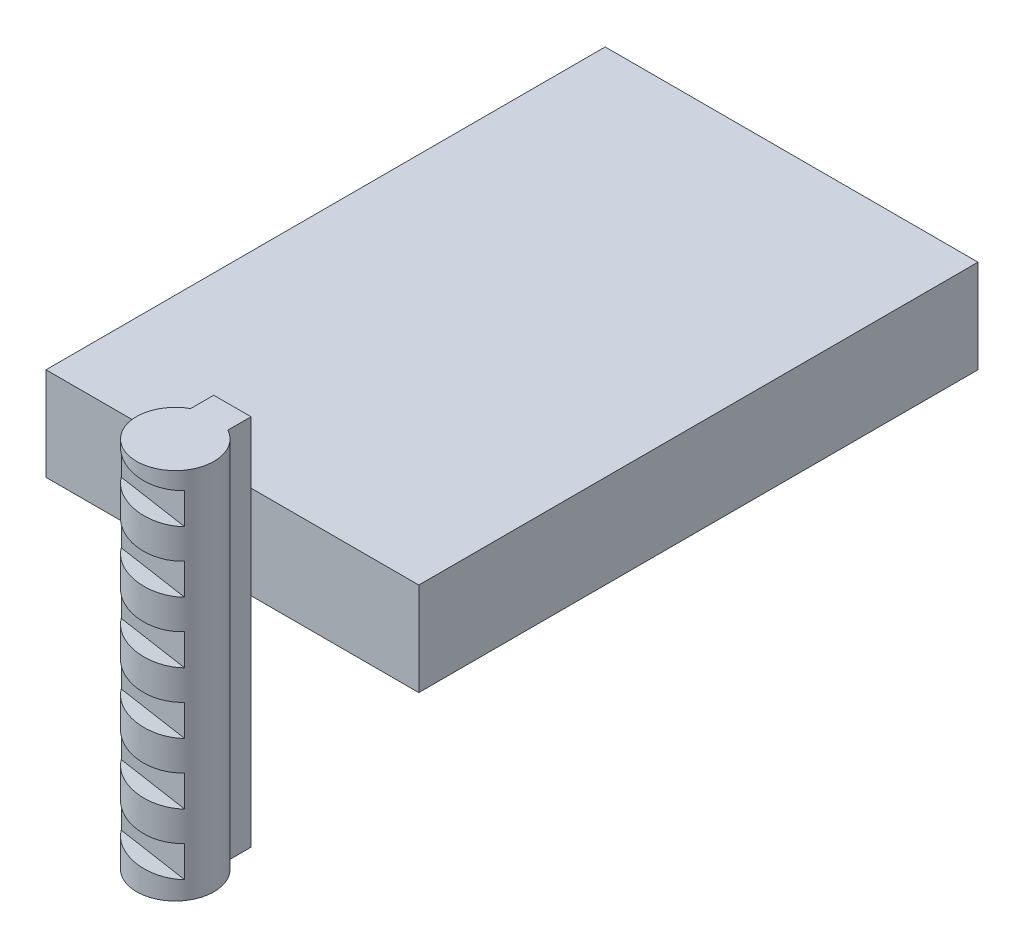
ISO-10303-21;
HEADER;
FILE_DESCRIPTION(('STEP AP214'),'2;1');
FILE_NAME('part.step','',(''),(''),'','','');
FILE_SCHEMA(('AUTOMOTIVE_DESIGN { 1 0 10303 214 1 1 1 1 }'));
ENDSEC;
DATA;
#1=APPLICATION_CONTEXT('core data for automotive mechanical design processes');
#2=APPLICATION_PROTOCOL_DEFINITION('international standard','automotive_design',2000,#1);
#3=PRODUCT_CONTEXT('',#1,'mechanical');
#4=PRODUCT('Part','Part','',(#3));
#5=PRODUCT_RELATED_PRODUCT_CATEGORY('part','',(#4));
#6=PRODUCT_DEFINITION_FORMATION('','',#4);
#7=PRODUCT_DEFINITION_CONTEXT('part definition',#1,'design');
#8=PRODUCT_DEFINITION('design','',#6,#7);
#9=PRODUCT_DEFINITION_SHAPE('','',#8);
#10=(LENGTH_UNIT() NAMED_UNIT(*) SI_UNIT(.MILLI.,.METRE.));
#11=(NAMED_UNIT(*) PLANE_ANGLE_UNIT() SI_UNIT($,.RADIAN.));
#12=(NAMED_UNIT(*) SI_UNIT($,.STERADIAN.) SOLID_ANGLE_UNIT());
#13=UNCERTAINTY_MEASURE_WITH_UNIT(LENGTH_MEASURE(1.E-05),#10,'distance_accuracy_value','');
#14=(GEOMETRIC_REPRESENTATION_CONTEXT(3) GLOBAL_UNCERTAINTY_ASSIGNED_CONTEXT((#13)) GLOBAL_UNIT_ASSIGNED_CONTEXT((#10,
#11,#12)) REPRESENTATION_CONTEXT('',''));
#15=CARTESIAN_POINT('',(0.,0.,0.));
#16=DIRECTION('',(0.,0.,1.));
#17=DIRECTION('',(1.,0.,0.));
#18=AXIS2_PLACEMENT_3D('',#15,#16,#17);
#19=CARTESIAN_POINT('',(-1.27,25.4,-3.89197217023223));
#20=DIRECTION('',(0.,0.,1.));
#21=DIRECTION('',(1.,0.,0.));
#22=AXIS2_PLACEMENT_3D('',#19,#20,#21);
#23=PLANE('',#22);
#24=DIRECTION('',(-1.,0.,0.));
#25=VECTOR('',#24,1.);
#26=CARTESIAN_POINT('',(12.7,14.8361124952174,-3.89197217023223));
#27=LINE('',#26,#25);
#28=CARTESIAN_POINT('',(1.27,14.8361124952174,-3.89197217023223));
#29=VERTEX_POINT('',#28);
#30=CARTESIAN_POINT('',(-1.27,14.8361124952174,-3.89197217023223));
#31=VERTEX_POINT('',#30);
#32=EDGE_CURVE('E364',#29,#31,#27,.T.);
#33=ORIENTED_EDGE('',*,*,#32,.F.);
#34=DIRECTION('',(0.,-1.,0.));
#35=VECTOR('',#34,1.);
#36=CARTESIAN_POINT('',(1.27,25.4,-3.89197217023223));
#37=LINE('',#36,#35);
#38=CARTESIAN_POINT('',(1.27,0.,-3.89197217023223));
#39=VERTEX_POINT('',#38);
#40=EDGE_CURVE('E413',#29,#39,#37,.T.);
#41=ORIENTED_EDGE('',*,*,#40,.T.);
#42=DIRECTION('',(-1.,0.,0.));
#43=VECTOR('',#42,1.);
#44=CARTESIAN_POINT('',(-1.27,0.,-3.89197217023223));
#45=LINE('',#44,#43);
#46=CARTESIAN_POINT('',(-1.27,0.,-3.89197217023223));
#47=VERTEX_POINT('',#46);
#48=EDGE_CURVE('E386',#39,#47,#45,.T.);
#49=ORIENTED_EDGE('',*,*,#48,.T.);
#50=DIRECTION('',(0.,-1.,0.));
#51=VECTOR('',#50,1.);
#52=CARTESIAN_POINT('',(-1.27,25.4,-3.89197217023223));
#53=LINE('',#52,#51);
#54=EDGE_CURVE('E395',#31,#47,#53,.T.);
#55=ORIENTED_EDGE('',*,*,#54,.F.);
#56=EDGE_LOOP('',(#33,#41,#49,#55));
#57=FACE_BOUND('',#56,.T.);
#58=ADVANCED_FACE('F41',(#57),#23,.F.);
#59=DIRECTION('',(1.,0.,0.));
#60=VECTOR('',#59,1.);
#61=CARTESIAN_POINT('',(12.7,21.1861124952174,-3.89197217023223));
#62=LINE('',#61,#60);
#63=CARTESIAN_POINT('',(-1.27,21.1861124952174,-3.89197217023223));
#64=VERTEX_POINT('',#63);
#65=CARTESIAN_POINT('',(1.27,21.1861124952174,-3.89197217023223));
#66=VERTEX_POINT('',#65);
#67=EDGE_CURVE('E357',#64,#66,#62,.T.);
#68=ORIENTED_EDGE('',*,*,#67,.F.);
#69=CARTESIAN_POINT('',(-1.27,25.4,-3.89197217023223));
#70=VERTEX_POINT('',#69);
#71=EDGE_CURVE('E409',#70,#64,#53,.T.);
#72=ORIENTED_EDGE('',*,*,#71,.F.);
#73=DIRECTION('',(-1.,0.,0.));
#74=VECTOR('',#73,1.);
#75=CARTESIAN_POINT('',(-1.27,25.4,-3.89197217023223));
#76=LINE('',#75,#74);
#77=CARTESIAN_POINT('',(1.27,25.4,-3.89197217023223));
#78=VERTEX_POINT('',#77);
#79=EDGE_CURVE('E392',#78,#70,#76,.T.);
#80=ORIENTED_EDGE('',*,*,#79,.F.);
#81=EDGE_CURVE('E415',#78,#66,#37,.T.);
#82=ORIENTED_EDGE('',*,*,#81,.T.);
#83=EDGE_LOOP('',(#68,#72,#80,#82));
#84=FACE_BOUND('',#83,.T.);
#85=ADVANCED_FACE('F483',(#84),#23,.F.);
#86=CARTESIAN_POINT('',(-1.27,25.4,-3.89197217023223));
#87=DIRECTION('',(1.,0.,0.));
#88=DIRECTION('',(0.,0.,-1.));
#89=AXIS2_PLACEMENT_3D('',#86,#87,#88);
#90=PLANE('',#89);
#91=DIRECTION('',(0.,0.,1.));
#92=VECTOR('',#91,1.);
#93=CARTESIAN_POINT('',(-1.27,0.,-3.89197217023223));
#94=LINE('',#93,#92);
#95=CARTESIAN_POINT('',(-1.27,0.,-2.31565629823223));
#96=VERTEX_POINT('',#95);
#97=EDGE_CURVE('E380',#47,#96,#94,.T.);
#98=ORIENTED_EDGE('',*,*,#97,.T.);
#99=DIRECTION('',(0.,-1.,0.));
#100=VECTOR('',#99,1.);
#101=CARTESIAN_POINT('',(-1.27,25.4,-2.31565629823223));
#102=LINE('',#101,#100);
#103=CARTESIAN_POINT('',(-1.27,25.4,-2.31565629823223));
#104=VERTEX_POINT('',#103);
#105=EDGE_CURVE('E423',#104,#96,#102,.T.);
#106=ORIENTED_EDGE('',*,*,#105,.F.);
#107=DIRECTION('',(0.,0.,1.));
#108=VECTOR('',#107,1.);
#109=CARTESIAN_POINT('',(-1.27,25.4,-3.89197217023223));
#110=LINE('',#109,#108);
#111=EDGE_CURVE('E381',#70,#104,#110,.T.);
#112=ORIENTED_EDGE('',*,*,#111,.F.);
#113=ORIENTED_EDGE('',*,*,#71,.T.);
#114=EDGE_CURVE('E414',#64,#31,#53,.T.);
#115=ORIENTED_EDGE('',*,*,#114,.T.);
#116=ORIENTED_EDGE('',*,*,#54,.T.);
#117=EDGE_LOOP('',(#98,#106,#112,#113,#115,#116));
#118=FACE_BOUND('',#117,.T.);
#119=ADVANCED_FACE('F43',(#118),#90,.F.);
#120=CARTESIAN_POINT('',(0.,25.4,0.));
#121=DIRECTION('',(0.,-1.,0.));
#122=DIRECTION('',(0.,0.,-1.));
#123=AXIS2_PLACEMENT_3D('',#120,#121,#122);
#124=CYLINDRICAL_SURFACE('',#123,2.64105359497731);
#125=CARTESIAN_POINT('',(0.,24.6324120030244,0.));
#126=DIRECTION('',(0.173542395888909,0.984207834737689,0.034899496702501));
#127=DIRECTION('',(0.964890402631267,-0.17701677333222,0.194040132109626));
#128=AXIS2_PLACEMENT_3D('',#125,#126,#127);
#129=ELLIPSE('',#128,2.68343077728213,2.64105359497731);
#130=CARTESIAN_POINT('',(-2.15698588116441,24.9587065654191,1.524));
#131=VERTEX_POINT('',#130);
#132=CARTESIAN_POINT('',(2.15698588116441,24.1980369497061,1.524));
#133=VERTEX_POINT('',#132);
#134=EDGE_CURVE('E50',#131,#133,#129,.T.);
#135=ORIENTED_EDGE('',*,*,#134,.T.);
#136=DIRECTION('',(0.,-1.,0.));
#137=VECTOR('',#136,1.);
#138=CARTESIAN_POINT('',(2.15698588116441,25.4,1.524));
#139=LINE('',#138,#137);
#140=CARTESIAN_POINT('',(2.15698588116441,22.0662491375512,1.524));
#141=VERTEX_POINT('',#140);
#142=EDGE_CURVE('E11',#133,#141,#139,.T.);
#143=ORIENTED_EDGE('',*,*,#142,.T.);
#144=CARTESIAN_POINT('',(0.,22.392543699946,0.));
#145=DIRECTION('',(-0.173542395888909,-0.984207834737689,0.034899496702501));
#146=DIRECTION('',(0.964890402631267,-0.17701677333222,-0.194040132109626));
#147=AXIS2_PLACEMENT_3D('',#144,#145,#146);
#148=ELLIPSE('',#147,2.68343077728213,2.64105359497731);
#149=CARTESIAN_POINT('',(-2.15698588116441,22.8269187532642,1.524));
#150=VERTEX_POINT('',#149);
#151=EDGE_CURVE('E287',#141,#150,#148,.T.);
#152=ORIENTED_EDGE('',*,*,#151,.T.);
#153=DIRECTION('',(0.,-1.,0.));
#154=VECTOR('',#153,1.);
#155=CARTESIAN_POINT('',(-2.15698588116441,25.4,1.524));
#156=LINE('',#155,#154);
#157=EDGE_CURVE('E283',#150,#131,#156,.F.);
#158=ORIENTED_EDGE('',*,*,#157,.T.);
#159=EDGE_LOOP('',(#135,#143,#152,#158));
#160=FACE_BOUND('',#159,.T.);
#161=CARTESIAN_POINT('',(0.,16.3012120030244,0.));
#162=DIRECTION('',(0.173542395888909,0.984207834737689,0.034899496702501));
#163=DIRECTION('',(0.964890402631267,-0.17701677333222,0.194040132109626));
#164=AXIS2_PLACEMENT_3D('',#161,#162,#163);
#165=ELLIPSE('',#164,2.68343077728213,2.64105359497731);
#166=CARTESIAN_POINT('',(-2.15698588116441,16.6275065654191,1.524));
#167=VERTEX_POINT('',#166);
#168=CARTESIAN_POINT('',(2.15698588116441,15.8668369497061,1.524));
#169=VERTEX_POINT('',#168);
#170=EDGE_CURVE('E275',#167,#169,#165,.T.);
#171=ORIENTED_EDGE('',*,*,#170,.T.);
#172=DIRECTION('',(0.,-1.,0.));
#173=VECTOR('',#172,1.);
#174=CARTESIAN_POINT('',(2.15698588116441,25.4,1.524));
#175=LINE('',#174,#173);
#176=CARTESIAN_POINT('',(2.15698588116441,13.7350491375512,1.524));
#177=VERTEX_POINT('',#176);
#178=EDGE_CURVE('E279',#169,#177,#175,.T.);
#179=ORIENTED_EDGE('',*,*,#178,.T.);
#180=CARTESIAN_POINT('',(0.,14.061343699946,0.));
#181=DIRECTION('',(-0.173542395888909,-0.984207834737689,0.034899496702501));
#182=DIRECTION('',(0.964890402631267,-0.17701677333222,-0.194040132109626));
#183=AXIS2_PLACEMENT_3D('',#180,#181,#182);
#184=ELLIPSE('',#183,2.68343077728213,2.64105359497731);
#185=CARTESIAN_POINT('',(-2.15698588116441,14.4957187532642,1.524));
#186=VERTEX_POINT('',#185);
#187=EDGE_CURVE('E271',#177,#186,#184,.T.);
#188=ORIENTED_EDGE('',*,*,#187,.T.);
#189=DIRECTION('',(0.,-1.,0.));
#190=VECTOR('',#189,1.);
#191=CARTESIAN_POINT('',(-2.15698588116441,25.4,1.524));
#192=LINE('',#191,#190);
#193=EDGE_CURVE('E267',#186,#167,#192,.F.);
#194=ORIENTED_EDGE('',*,*,#193,.T.);
#195=EDGE_LOOP('',(#171,#179,#188,#194));
#196=FACE_BOUND('',#195,.T.);
#197=CARTESIAN_POINT('',(0.,20.4668120030244,0.));
#198=DIRECTION('',(0.173542395888909,0.984207834737689,0.034899496702501));
#199=DIRECTION('',(0.964890402631267,-0.17701677333222,0.194040132109626));
#200=AXIS2_PLACEMENT_3D('',#197,#198,#199);
#201=ELLIPSE('',#200,2.68343077728213,2.64105359497731);
#202=CARTESIAN_POINT('',(-2.15698588116441,20.7931065654191,1.524));
#203=VERTEX_POINT('',#202);
#204=CARTESIAN_POINT('',(2.15698588116441,20.0324369497061,1.524));
#205=VERTEX_POINT('',#204);
#206=EDGE_CURVE('E259',#203,#205,#201,.T.);
#207=ORIENTED_EDGE('',*,*,#206,.T.);
#208=DIRECTION('',(0.,-1.,0.));
#209=VECTOR('',#208,1.);
#210=CARTESIAN_POINT('',(2.15698588116441,25.4,1.524));
#211=LINE('',#210,#209);
#212=CARTESIAN_POINT('',(2.15698588116441,17.9006491375512,1.524));
#213=VERTEX_POINT('',#212);
#214=EDGE_CURVE('E263',#205,#213,#211,.T.);
#215=ORIENTED_EDGE('',*,*,#214,.T.);
#216=CARTESIAN_POINT('',(0.,18.226943699946,0.));
#217=DIRECTION('',(-0.173542395888909,-0.984207834737689,0.034899496702501));
#218=DIRECTION('',(0.964890402631267,-0.17701677333222,-0.194040132109626));
#219=AXIS2_PLACEMENT_3D('',#216,#217,#218);
#220=ELLIPSE('',#219,2.68343077728213,2.64105359497731);
#221=CARTESIAN_POINT('',(-2.15698588116441,18.6613187532642,1.524));
#222=VERTEX_POINT('',#221);
#223=EDGE_CURVE('E255',#213,#222,#220,.T.);
#224=ORIENTED_EDGE('',*,*,#223,.T.);
#225=DIRECTION('',(0.,-1.,0.));
#226=VECTOR('',#225,1.);
#227=CARTESIAN_POINT('',(-2.15698588116441,25.4,1.524));
#228=LINE('',#227,#226);
#229=EDGE_CURVE('E251',#222,#203,#228,.F.);
#230=ORIENTED_EDGE('',*,*,#229,.T.);
#231=EDGE_LOOP('',(#207,#215,#224,#230));
#232=FACE_BOUND('',#231,.T.);
#233=CARTESIAN_POINT('',(0.,12.1356120030244,0.));
#234=DIRECTION('',(0.173542395888909,0.984207834737689,0.034899496702501));
#235=DIRECTION('',(0.964890402631267,-0.17701677333222,0.194040132109626));
#236=AXIS2_PLACEMENT_3D('',#233,#234,#235);
#237=ELLIPSE('',#236,2.68343077728213,2.64105359497731);
#238=CARTESIAN_POINT('',(-2.15698588116441,12.4619065654191,1.524));
#239=VERTEX_POINT('',#238);
#240=CARTESIAN_POINT('',(2.15698588116441,11.7012369497061,1.524));
#241=VERTEX_POINT('',#240);
#242=EDGE_CURVE('E243',#239,#241,#237,.T.);
#243=ORIENTED_EDGE('',*,*,#242,.T.);
#244=DIRECTION('',(0.,-1.,0.));
#245=VECTOR('',#244,1.);
#246=CARTESIAN_POINT('',(2.15698588116441,25.4,1.524));
#247=LINE('',#246,#245);
#248=CARTESIAN_POINT('',(2.15698588116441,9.56944913755123,1.524));
#249=VERTEX_POINT('',#248);
#250=EDGE_CURVE('E247',#241,#249,#247,.T.);
#251=ORIENTED_EDGE('',*,*,#250,.T.);
#252=CARTESIAN_POINT('',(0.,9.89574369994597,0.));
#253=DIRECTION('',(-0.173542395888909,-0.984207834737689,0.034899496702501));
#254=DIRECTION('',(0.964890402631267,-0.17701677333222,-0.194040132109626));
#255=AXIS2_PLACEMENT_3D('',#252,#253,#254);
#256=ELLIPSE('',#255,2.68343077728213,2.64105359497731);
#257=CARTESIAN_POINT('',(-2.15698588116441,10.3301187532642,1.524));
#258=VERTEX_POINT('',#257);
#259=EDGE_CURVE('E239',#249,#258,#256,.T.);
#260=ORIENTED_EDGE('',*,*,#259,.T.);
#261=DIRECTION('',(0.,-1.,0.));
#262=VECTOR('',#261,1.);
#263=CARTESIAN_POINT('',(-2.15698588116441,25.4,1.524));
#264=LINE('',#263,#262);
#265=EDGE_CURVE('E235',#258,#239,#264,.F.);
#266=ORIENTED_EDGE('',*,*,#265,.T.);
#267=EDGE_LOOP('',(#243,#251,#260,#266));
#268=FACE_BOUND('',#267,.T.);
#269=CARTESIAN_POINT('',(0.,7.97001200302437,0.));
#270=DIRECTION('',(0.173542395888909,0.984207834737689,0.034899496702501));
#271=DIRECTION('',(0.964890402631267,-0.17701677333222,0.194040132109626));
#272=AXIS2_PLACEMENT_3D('',#269,#270,#271);
#273=ELLIPSE('',#272,2.68343077728213,2.64105359497731);
#274=CARTESIAN_POINT('',(-2.15698588116441,8.29630656541911,1.524));
#275=VERTEX_POINT('',#274);
#276=CARTESIAN_POINT('',(2.15698588116441,7.53563694970611,1.524));
#277=VERTEX_POINT('',#276);
#278=EDGE_CURVE('E227',#275,#277,#273,.T.);
#279=ORIENTED_EDGE('',*,*,#278,.T.);
#280=DIRECTION('',(0.,-1.,0.));
#281=VECTOR('',#280,1.);
#282=CARTESIAN_POINT('',(2.15698588116441,25.4,1.524));
#283=LINE('',#282,#281);
#284=CARTESIAN_POINT('',(2.15698588116441,5.40384913755124,1.524));
#285=VERTEX_POINT('',#284);
#286=EDGE_CURVE('E231',#277,#285,#283,.T.);
#287=ORIENTED_EDGE('',*,*,#286,.T.);
#288=CARTESIAN_POINT('',(0.,5.73014369994597,0.));
#289=DIRECTION('',(-0.173542395888909,-0.984207834737689,0.034899496702501));
#290=DIRECTION('',(0.964890402631267,-0.17701677333222,-0.194040132109626));
#291=AXIS2_PLACEMENT_3D('',#288,#289,#290);
#292=ELLIPSE('',#291,2.68343077728213,2.64105359497731);
#293=CARTESIAN_POINT('',(-2.15698588116441,6.16451875326423,1.524));
#294=VERTEX_POINT('',#293);
#295=EDGE_CURVE('E223',#285,#294,#292,.T.);
#296=ORIENTED_EDGE('',*,*,#295,.T.);
#297=DIRECTION('',(0.,-1.,0.));
#298=VECTOR('',#297,1.);
#299=CARTESIAN_POINT('',(-2.15698588116441,25.4,1.524));
#300=LINE('',#299,#298);
#301=EDGE_CURVE('E202',#294,#275,#300,.F.);
#302=ORIENTED_EDGE('',*,*,#301,.T.);
#303=EDGE_LOOP('',(#279,#287,#296,#302));
#304=FACE_BOUND('',#303,.T.);
#305=CARTESIAN_POINT('',(0.,3.80441200302437,0.));
#306=DIRECTION('',(0.173542395888909,0.984207834737689,0.034899496702501));
#307=DIRECTION('',(0.964890402631267,-0.17701677333222,0.194040132109626));
#308=AXIS2_PLACEMENT_3D('',#305,#306,#307);
#309=ELLIPSE('',#308,2.68343077728213,2.64105359497731);
#310=CARTESIAN_POINT('',(-2.15698588116441,4.13070656541911,1.524));
#311=VERTEX_POINT('',#310);
#312=CARTESIAN_POINT('',(2.15698588116441,3.37003694970611,1.524));
#313=VERTEX_POINT('',#312);
#314=EDGE_CURVE('E203',#311,#313,#309,.T.);
#315=ORIENTED_EDGE('',*,*,#314,.T.);
#316=DIRECTION('',(0.,-1.,0.));
#317=VECTOR('',#316,1.);
#318=CARTESIAN_POINT('',(2.15698588116441,25.4,1.524));
#319=LINE('',#318,#317);
#320=CARTESIAN_POINT('',(2.15698588116441,1.23824913755124,1.524));
#321=VERTEX_POINT('',#320);
#322=EDGE_CURVE('E191',#313,#321,#319,.T.);
#323=ORIENTED_EDGE('',*,*,#322,.T.);
#324=CARTESIAN_POINT('',(0.,1.56454369994597,0.));
#325=DIRECTION('',(-0.173542395888909,-0.984207834737689,0.034899496702501));
#326=DIRECTION('',(0.964890402631267,-0.17701677333222,-0.194040132109626));
#327=AXIS2_PLACEMENT_3D('',#324,#325,#326);
#328=ELLIPSE('',#327,2.68343077728213,2.64105359497731);
#329=CARTESIAN_POINT('',(-2.15698588116441,1.99891875326423,1.524));
#330=VERTEX_POINT('',#329);
#331=EDGE_CURVE('E214',#321,#330,#328,.T.);
#332=ORIENTED_EDGE('',*,*,#331,.T.);
#333=DIRECTION('',(0.,-1.,0.));
#334=VECTOR('',#333,1.);
#335=CARTESIAN_POINT('',(-2.15698588116441,25.4,1.524));
#336=LINE('',#335,#334);
#337=EDGE_CURVE('E212',#330,#311,#336,.F.);
#338=ORIENTED_EDGE('',*,*,#337,.T.);
#339=EDGE_LOOP('',(#315,#323,#332,#338));
#340=FACE_BOUND('',#339,.T.);
#341=CARTESIAN_POINT('',(0.,0.,0.));
#342=DIRECTION('',(0.,1.,0.));
#343=DIRECTION('',(0.,0.,1.));
#344=AXIS2_PLACEMENT_3D('',#341,#342,#343);
#345=CIRCLE('',#344,2.64105359497731);
#346=CARTESIAN_POINT('',(1.27,0.,-2.31565629823223));
#347=VERTEX_POINT('',#346);
#348=EDGE_CURVE('E399',#96,#347,#345,.T.);
#349=ORIENTED_EDGE('',*,*,#348,.T.);
#350=DIRECTION('',(0.,-1.,0.));
#351=VECTOR('',#350,1.);
#352=CARTESIAN_POINT('',(1.27,25.4,-2.31565629823223));
#353=LINE('',#352,#351);
#354=CARTESIAN_POINT('',(1.27,25.4,-2.31565629823223));
#355=VERTEX_POINT('',#354);
#356=EDGE_CURVE('E418',#355,#347,#353,.T.);
#357=ORIENTED_EDGE('',*,*,#356,.F.);
#358=CARTESIAN_POINT('',(0.,25.4,0.));
#359=DIRECTION('',(0.,1.,0.));
#360=DIRECTION('',(0.,0.,1.));
#361=AXIS2_PLACEMENT_3D('',#358,#359,#360);
#362=CIRCLE('',#361,2.64105359497731);
#363=EDGE_CURVE('E385',#104,#355,#362,.T.);
#364=ORIENTED_EDGE('',*,*,#363,.F.);
#365=ORIENTED_EDGE('',*,*,#105,.T.);
#366=EDGE_LOOP('',(#349,#357,#364,#365));
#367=FACE_BOUND('',#366,.T.);
#368=ADVANCED_FACE('F210',(#160,#196,#232,#268,#304,#340,#367),#124,.T.);
#369=CARTESIAN_POINT('',(1.27,25.4,-3.89197217023223));
#370=DIRECTION('',(-1.,0.,0.));
#371=DIRECTION('',(0.,0.,1.));
#372=AXIS2_PLACEMENT_3D('',#369,#370,#371);
#373=PLANE('',#372);
#374=DIRECTION('',(0.,0.,-1.));
#375=VECTOR('',#374,1.);
#376=CARTESIAN_POINT('',(1.27,0.,-3.89197217023223));
#377=LINE('',#376,#375);
#378=EDGE_CURVE('E402',#347,#39,#377,.T.);
#379=ORIENTED_EDGE('',*,*,#378,.T.);
#380=ORIENTED_EDGE('',*,*,#40,.F.);
#381=EDGE_CURVE('E419',#66,#29,#37,.T.);
#382=ORIENTED_EDGE('',*,*,#381,.F.);
#383=ORIENTED_EDGE('',*,*,#81,.F.);
#384=DIRECTION('',(0.,0.,-1.));
#385=VECTOR('',#384,1.);
#386=CARTESIAN_POINT('',(1.27,25.4,-3.89197217023223));
#387=LINE('',#386,#385);
#388=EDGE_CURVE('E389',#355,#78,#387,.T.);
#389=ORIENTED_EDGE('',*,*,#388,.F.);
#390=ORIENTED_EDGE('',*,*,#356,.T.);
#391=EDGE_LOOP('',(#379,#380,#382,#383,#389,#390));
#392=FACE_BOUND('',#391,.T.);
#393=ADVANCED_FACE('F470',(#392),#373,.F.);
#394=CARTESIAN_POINT('',(0.,25.4,0.));
#395=DIRECTION('',(0.,1.,0.));
#396=DIRECTION('',(0.,0.,1.));
#397=AXIS2_PLACEMENT_3D('',#394,#395,#396);
#398=PLANE('',#397);
#399=ORIENTED_EDGE('',*,*,#111,.T.);
#400=ORIENTED_EDGE('',*,*,#363,.T.);
#401=ORIENTED_EDGE('',*,*,#388,.T.);
#402=ORIENTED_EDGE('',*,*,#79,.T.);
#403=EDGE_LOOP('',(#399,#400,#401,#402));
#404=FACE_BOUND('',#403,.T.);
#405=ADVANCED_FACE('F503',(#404),#398,.T.);
#406=CARTESIAN_POINT('',(0.,0.,0.));
#407=DIRECTION('',(0.,1.,0.));
#408=DIRECTION('',(0.,0.,1.));
#409=AXIS2_PLACEMENT_3D('',#406,#407,#408);
#410=PLANE('',#409);
#411=ORIENTED_EDGE('',*,*,#97,.F.);
#412=ORIENTED_EDGE('',*,*,#48,.F.);
#413=ORIENTED_EDGE('',*,*,#378,.F.);
#414=ORIENTED_EDGE('',*,*,#348,.F.);
#415=EDGE_LOOP('',(#411,#412,#413,#414));
#416=FACE_BOUND('',#415,.T.);
#417=ADVANCED_FACE('F474',(#416),#410,.F.);
#418=CARTESIAN_POINT('',(0.,0.,-3.89197217023223));
#419=DIRECTION('',(0.,0.,-1.));
#420=DIRECTION('',(-1.,0.,0.));
#421=AXIS2_PLACEMENT_3D('',#418,#419,#420);
#422=PLANE('',#421);
#423=CARTESIAN_POINT('',(12.7,21.1861124952174,-3.89197217023223));
#424=VERTEX_POINT('',#423);
#425=EDGE_CURVE('E351',#66,#424,#62,.T.);
#426=ORIENTED_EDGE('',*,*,#425,.F.);
#427=ORIENTED_EDGE('',*,*,#381,.T.);
#428=CARTESIAN_POINT('',(12.7,14.8361124952174,-3.89197217023223));
#429=VERTEX_POINT('',#428);
#430=EDGE_CURVE('E338',#429,#29,#27,.T.);
#431=ORIENTED_EDGE('',*,*,#430,.F.);
#432=DIRECTION('',(0.,-1.,0.));
#433=VECTOR('',#432,1.);
#434=CARTESIAN_POINT('',(12.7,21.1861124952174,-3.89197217023223));
#435=LINE('',#434,#433);
#436=EDGE_CURVE('E356',#424,#429,#435,.T.);
#437=ORIENTED_EDGE('',*,*,#436,.F.);
#438=EDGE_LOOP('',(#426,#427,#431,#437));
#439=FACE_BOUND('',#438,.T.);
#440=ADVANCED_FACE('F459',(#439),#422,.F.);
#441=CARTESIAN_POINT('',(-12.7,21.1861124952174,-41.9919721702322));
#442=DIRECTION('',(1.,0.,0.));
#443=DIRECTION('',(0.,0.,-1.));
#444=AXIS2_PLACEMENT_3D('',#441,#442,#443);
#445=PLANE('',#444);
#446=DIRECTION('',(0.,1.,0.));
#447=VECTOR('',#446,1.);
#448=CARTESIAN_POINT('',(-12.7,21.1861124952174,-3.89197217023223));
#449=LINE('',#448,#447);
#450=CARTESIAN_POINT('',(-12.7,14.8361124952174,-3.89197217023223));
#451=VERTEX_POINT('',#450);
#452=CARTESIAN_POINT('',(-12.7,21.1861124952174,-3.89197217023223));
#453=VERTEX_POINT('',#452);
#454=EDGE_CURVE('E303',#451,#453,#449,.T.);
#455=ORIENTED_EDGE('',*,*,#454,.T.);
#456=DIRECTION('',(0.,0.,1.));
#457=VECTOR('',#456,1.);
#458=CARTESIAN_POINT('',(-12.7,21.1861124952174,-41.9919721702322));
#459=LINE('',#458,#457);
#460=CARTESIAN_POINT('',(-12.7,21.1861124952174,-41.9919721702322));
#461=VERTEX_POINT('',#460);
#462=EDGE_CURVE('E376',#461,#453,#459,.T.);
#463=ORIENTED_EDGE('',*,*,#462,.F.);
#464=DIRECTION('',(0.,1.,0.));
#465=VECTOR('',#464,1.);
#466=CARTESIAN_POINT('',(-12.7,21.1861124952174,-41.9919721702322));
#467=LINE('',#466,#465);
#468=CARTESIAN_POINT('',(-12.7,14.8361124952174,-41.9919721702322));
#469=VERTEX_POINT('',#468);
#470=EDGE_CURVE('E333',#469,#461,#467,.T.);
#471=ORIENTED_EDGE('',*,*,#470,.F.);
#472=DIRECTION('',(0.,0.,1.));
#473=VECTOR('',#472,1.);
#474=CARTESIAN_POINT('',(-12.7,14.8361124952174,-41.9919721702322));
#475=LINE('',#474,#473);
#476=EDGE_CURVE('E347',#469,#451,#475,.T.);
#477=ORIENTED_EDGE('',*,*,#476,.T.);
#478=EDGE_LOOP('',(#455,#463,#471,#477));
#479=FACE_BOUND('',#478,.T.);
#480=ADVANCED_FACE('F442',(#479),#445,.F.);
#481=CARTESIAN_POINT('',(12.7,21.1861124952174,-41.9919721702322));
#482=DIRECTION('',(0.,-1.,0.));
#483=DIRECTION('',(0.,0.,-1.));
#484=AXIS2_PLACEMENT_3D('',#481,#482,#483);
#485=PLANE('',#484);
#486=EDGE_CURVE('E352',#453,#64,#62,.T.);
#487=ORIENTED_EDGE('',*,*,#486,.T.);
#488=ORIENTED_EDGE('',*,*,#67,.T.);
#489=ORIENTED_EDGE('',*,*,#425,.T.);
#490=DIRECTION('',(0.,0.,1.));
#491=VECTOR('',#490,1.);
#492=CARTESIAN_POINT('',(12.7,21.1861124952174,-41.9919721702322));
#493=LINE('',#492,#491);
#494=CARTESIAN_POINT('',(12.7,21.1861124952174,-41.9919721702322));
#495=VERTEX_POINT('',#494);
#496=EDGE_CURVE('E372',#495,#424,#493,.T.);
#497=ORIENTED_EDGE('',*,*,#496,.F.);
#498=DIRECTION('',(1.,0.,0.));
#499=VECTOR('',#498,1.);
#500=CARTESIAN_POINT('',(12.7,21.1861124952174,-41.9919721702322));
#501=LINE('',#500,#499);
#502=EDGE_CURVE('E337',#461,#495,#501,.T.);
#503=ORIENTED_EDGE('',*,*,#502,.F.);
#504=ORIENTED_EDGE('',*,*,#462,.T.);
#505=EDGE_LOOP('',(#487,#488,#489,#497,#503,#504));
#506=FACE_BOUND('',#505,.T.);
#507=ADVANCED_FACE('F447',(#506),#485,.F.);
#508=CARTESIAN_POINT('',(12.7,21.1861124952174,-41.9919721702322));
#509=DIRECTION('',(-1.,0.,0.));
#510=DIRECTION('',(0.,0.,1.));
#511=AXIS2_PLACEMENT_3D('',#508,#509,#510);
#512=PLANE('',#511);
#513=ORIENTED_EDGE('',*,*,#436,.T.);
#514=DIRECTION('',(0.,0.,1.));
#515=VECTOR('',#514,1.);
#516=CARTESIAN_POINT('',(12.7,14.8361124952174,-41.9919721702322));
#517=LINE('',#516,#515);
#518=CARTESIAN_POINT('',(12.7,14.8361124952174,-41.9919721702322));
#519=VERTEX_POINT('',#518);
#520=EDGE_CURVE('E368',#519,#429,#517,.T.);
#521=ORIENTED_EDGE('',*,*,#520,.F.);
#522=DIRECTION('',(0.,-1.,0.));
#523=VECTOR('',#522,1.);
#524=CARTESIAN_POINT('',(12.7,21.1861124952174,-41.9919721702322));
#525=LINE('',#524,#523);
#526=EDGE_CURVE('E341',#495,#519,#525,.T.);
#527=ORIENTED_EDGE('',*,*,#526,.F.);
#528=ORIENTED_EDGE('',*,*,#496,.T.);
#529=EDGE_LOOP('',(#513,#521,#527,#528));
#530=FACE_BOUND('',#529,.T.);
#531=ADVANCED_FACE('F485',(#530),#512,.F.);
#532=CARTESIAN_POINT('',(12.7,14.8361124952174,-41.9919721702322));
#533=DIRECTION('',(0.,1.,0.));
#534=DIRECTION('',(0.,0.,1.));
#535=AXIS2_PLACEMENT_3D('',#532,#533,#534);
#536=PLANE('',#535);
#537=ORIENTED_EDGE('',*,*,#430,.T.);
#538=ORIENTED_EDGE('',*,*,#32,.T.);
#539=EDGE_CURVE('E360',#31,#451,#27,.T.);
#540=ORIENTED_EDGE('',*,*,#539,.T.);
#541=ORIENTED_EDGE('',*,*,#476,.F.);
#542=DIRECTION('',(-1.,0.,0.));
#543=VECTOR('',#542,1.);
#544=CARTESIAN_POINT('',(12.7,14.8361124952174,-41.9919721702322));
#545=LINE('',#544,#543);
#546=EDGE_CURVE('E344',#519,#469,#545,.T.);
#547=ORIENTED_EDGE('',*,*,#546,.F.);
#548=ORIENTED_EDGE('',*,*,#520,.T.);
#549=EDGE_LOOP('',(#537,#538,#540,#541,#547,#548));
#550=FACE_BOUND('',#549,.T.);
#551=ADVANCED_FACE('F435',(#550),#536,.F.);
#552=CARTESIAN_POINT('',(0.,0.,-41.9919721702322));
#553=DIRECTION('',(0.,0.,-1.));
#554=DIRECTION('',(-1.,0.,0.));
#555=AXIS2_PLACEMENT_3D('',#552,#553,#554);
#556=PLANE('',#555);
#557=ORIENTED_EDGE('',*,*,#470,.T.);
#558=ORIENTED_EDGE('',*,*,#502,.T.);
#559=ORIENTED_EDGE('',*,*,#526,.T.);
#560=ORIENTED_EDGE('',*,*,#546,.T.);
#561=EDGE_LOOP('',(#557,#558,#559,#560));
#562=FACE_BOUND('',#561,.T.);
#563=ADVANCED_FACE('F451',(#562),#556,.T.);
#564=ORIENTED_EDGE('',*,*,#114,.F.);
#565=ORIENTED_EDGE('',*,*,#486,.F.);
#566=ORIENTED_EDGE('',*,*,#454,.F.);
#567=ORIENTED_EDGE('',*,*,#539,.F.);
#568=EDGE_LOOP('',(#564,#565,#566,#567));
#569=FACE_BOUND('',#568,.T.);
#570=ADVANCED_FACE('F444',(#569),#422,.F.);
#571=CARTESIAN_POINT('',(-3.11349521904125,4.17327106290894,5.08));
#572=DIRECTION('',(0.173542395888909,0.984207834737689,0.034899496702501));
#573=DIRECTION('',(-0.984807753012209,0.173648177666927,0.));
#574=AXIS2_PLACEMENT_3D('',#571,#572,#573);
#575=PLANE('',#574);
#576=DIRECTION('',(-0.984807753012209,0.173648177666927,0.));
#577=VECTOR('',#576,1.);
#578=CARTESIAN_POINT('',(-3.0919318911267,4.29556277248119,1.524));
#579=LINE('',#578,#577);
#580=EDGE_CURVE('E194',#313,#311,#579,.T.);
#581=ORIENTED_EDGE('',*,*,#580,.F.);
#582=ORIENTED_EDGE('',*,*,#314,.F.);
#583=EDGE_LOOP('',(#581,#582));
#584=FACE_BOUND('',#583,.T.);
#585=ADVANCED_FACE('F206',(#584),#575,.F.);
#586=CARTESIAN_POINT('',(-3.11349521904125,2.29367106290895,5.08));
#587=DIRECTION('',(-0.173542395888909,-0.984207834737689,0.034899496702501));
#588=DIRECTION('',(0.984807753012209,-0.173648177666927,0.));
#589=AXIS2_PLACEMENT_3D('',#586,#587,#588);
#590=PLANE('',#589);
#591=DIRECTION('',(0.984807753012209,-0.173648177666927,0.));
#592=VECTOR('',#591,1.);
#593=CARTESIAN_POINT('',(-3.13505854695579,2.17137935333671,1.524));
#594=LINE('',#593,#592);
#595=EDGE_CURVE('E197',#330,#321,#594,.T.);
#596=ORIENTED_EDGE('',*,*,#595,.F.);
#597=ORIENTED_EDGE('',*,*,#331,.F.);
#598=EDGE_LOOP('',(#596,#597));
#599=FACE_BOUND('',#598,.T.);
#600=ADVANCED_FACE('F599',(#599),#590,.F.);
#601=CARTESIAN_POINT('',(0.,0.,1.524));
#602=DIRECTION('',(0.,0.,-1.));
#603=DIRECTION('',(-1.,0.,0.));
#604=AXIS2_PLACEMENT_3D('',#601,#602,#603);
#605=PLANE('',#604);
#606=ORIENTED_EDGE('',*,*,#580,.T.);
#607=ORIENTED_EDGE('',*,*,#337,.F.);
#608=ORIENTED_EDGE('',*,*,#595,.T.);
#609=ORIENTED_EDGE('',*,*,#322,.F.);
#610=EDGE_LOOP('',(#606,#607,#608,#609));
#611=FACE_BOUND('',#610,.T.);
#612=ADVANCED_FACE('F193',(#611),#605,.F.);
#613=CARTESIAN_POINT('',(-3.11349521904125,8.33887106290894,5.08));
#614=DIRECTION('',(0.173542395888909,0.984207834737689,0.034899496702501));
#615=DIRECTION('',(-0.984807753012209,0.173648177666927,0.));
#616=AXIS2_PLACEMENT_3D('',#613,#614,#615);
#617=PLANE('',#616);
#618=DIRECTION('',(-0.984807753012209,0.173648177666927,0.));
#619=VECTOR('',#618,1.);
#620=CARTESIAN_POINT('',(-3.0919318911267,8.46116277248118,1.524));
#621=LINE('',#620,#619);
#622=EDGE_CURVE('E325',#277,#275,#621,.T.);
#623=ORIENTED_EDGE('',*,*,#622,.F.);
#624=ORIENTED_EDGE('',*,*,#278,.F.);
#625=EDGE_LOOP('',(#623,#624));
#626=FACE_BOUND('',#625,.T.);
#627=ADVANCED_FACE('F617',(#626),#617,.F.);
#628=CARTESIAN_POINT('',(-3.11349521904125,6.45927106290894,5.08));
#629=DIRECTION('',(-0.173542395888909,-0.984207834737689,0.034899496702501));
#630=DIRECTION('',(0.984807753012209,-0.173648177666927,0.));
#631=AXIS2_PLACEMENT_3D('',#628,#629,#630);
#632=PLANE('',#631);
#633=DIRECTION('',(0.984807753012209,-0.173648177666927,0.));
#634=VECTOR('',#633,1.);
#635=CARTESIAN_POINT('',(-3.13505854695579,6.3369793533367,1.524));
#636=LINE('',#635,#634);
#637=EDGE_CURVE('E321',#294,#285,#636,.T.);
#638=ORIENTED_EDGE('',*,*,#637,.F.);
#639=ORIENTED_EDGE('',*,*,#295,.F.);
#640=EDGE_LOOP('',(#638,#639));
#641=FACE_BOUND('',#640,.T.);
#642=ADVANCED_FACE('F626',(#641),#632,.F.);
#643=CARTESIAN_POINT('',(0.,0.,1.524));
#644=DIRECTION('',(0.,0.,-1.));
#645=DIRECTION('',(-1.,0.,0.));
#646=AXIS2_PLACEMENT_3D('',#643,#644,#645);
#647=PLANE('',#646);
#648=ORIENTED_EDGE('',*,*,#622,.T.);
#649=ORIENTED_EDGE('',*,*,#301,.F.);
#650=ORIENTED_EDGE('',*,*,#637,.T.);
#651=ORIENTED_EDGE('',*,*,#286,.F.);
#652=EDGE_LOOP('',(#648,#649,#650,#651));
#653=FACE_BOUND('',#652,.T.);
#654=ADVANCED_FACE('F636',(#653),#647,.F.);
#655=CARTESIAN_POINT('',(-3.11349521904125,12.5044710629089,5.08));
#656=DIRECTION('',(0.173542395888909,0.984207834737689,0.034899496702501));
#657=DIRECTION('',(-0.984807753012209,0.173648177666927,0.));
#658=AXIS2_PLACEMENT_3D('',#655,#656,#657);
#659=PLANE('',#658);
#660=DIRECTION('',(-0.984807753012209,0.173648177666927,0.));
#661=VECTOR('',#660,1.);
#662=CARTESIAN_POINT('',(-3.0919318911267,12.6267627724812,1.524));
#663=LINE('',#662,#661);
#664=EDGE_CURVE('E318',#241,#239,#663,.T.);
#665=ORIENTED_EDGE('',*,*,#664,.F.);
#666=ORIENTED_EDGE('',*,*,#242,.F.);
#667=EDGE_LOOP('',(#665,#666));
#668=FACE_BOUND('',#667,.T.);
#669=ADVANCED_FACE('F646',(#668),#659,.F.);
#670=CARTESIAN_POINT('',(-3.11349521904125,10.6248710629089,5.08));
#671=DIRECTION('',(-0.173542395888909,-0.984207834737689,0.034899496702501));
#672=DIRECTION('',(0.984807753012209,-0.173648177666927,0.));
#673=AXIS2_PLACEMENT_3D('',#670,#671,#672);
#674=PLANE('',#673);
#675=DIRECTION('',(0.984807753012209,-0.173648177666927,0.));
#676=VECTOR('',#675,1.);
#677=CARTESIAN_POINT('',(-3.1350585469558,10.5025793533367,1.524));
#678=LINE('',#677,#676);
#679=EDGE_CURVE('E314',#258,#249,#678,.T.);
#680=ORIENTED_EDGE('',*,*,#679,.F.);
#681=ORIENTED_EDGE('',*,*,#259,.F.);
#682=EDGE_LOOP('',(#680,#681));
#683=FACE_BOUND('',#682,.T.);
#684=ADVANCED_FACE('F656',(#683),#674,.F.);
#685=CARTESIAN_POINT('',(0.,0.,1.524));
#686=DIRECTION('',(0.,0.,-1.));
#687=DIRECTION('',(-1.,0.,0.));
#688=AXIS2_PLACEMENT_3D('',#685,#686,#687);
#689=PLANE('',#688);
#690=ORIENTED_EDGE('',*,*,#664,.T.);
#691=ORIENTED_EDGE('',*,*,#265,.F.);
#692=ORIENTED_EDGE('',*,*,#679,.T.);
#693=ORIENTED_EDGE('',*,*,#250,.F.);
#694=EDGE_LOOP('',(#690,#691,#692,#693));
#695=FACE_BOUND('',#694,.T.);
#696=ADVANCED_FACE('F666',(#695),#689,.F.);
#697=CARTESIAN_POINT('',(-3.11349521904125,20.8356710629089,5.08));
#698=DIRECTION('',(0.173542395888909,0.984207834737689,0.034899496702501));
#699=DIRECTION('',(-0.984807753012209,0.173648177666927,0.));
#700=AXIS2_PLACEMENT_3D('',#697,#698,#699);
#701=PLANE('',#700);
#702=DIRECTION('',(-0.984807753012209,0.173648177666927,0.));
#703=VECTOR('',#702,1.);
#704=CARTESIAN_POINT('',(-3.0919318911267,20.9579627724812,1.524));
#705=LINE('',#704,#703);
#706=EDGE_CURVE('E311',#205,#203,#705,.T.);
#707=ORIENTED_EDGE('',*,*,#706,.F.);
#708=ORIENTED_EDGE('',*,*,#206,.F.);
#709=EDGE_LOOP('',(#707,#708));
#710=FACE_BOUND('',#709,.T.);
#711=ADVANCED_FACE('F676',(#710),#701,.F.);
#712=CARTESIAN_POINT('',(-3.11349521904125,18.9560710629089,5.08));
#713=DIRECTION('',(-0.173542395888909,-0.984207834737689,0.034899496702501));
#714=DIRECTION('',(0.984807753012209,-0.173648177666927,0.));
#715=AXIS2_PLACEMENT_3D('',#712,#713,#714);
#716=PLANE('',#715);
#717=DIRECTION('',(0.984807753012209,-0.173648177666927,0.));
#718=VECTOR('',#717,1.);
#719=CARTESIAN_POINT('',(-3.1350585469558,18.8337793533367,1.524));
#720=LINE('',#719,#718);
#721=EDGE_CURVE('E309',#222,#213,#720,.T.);
#722=ORIENTED_EDGE('',*,*,#721,.F.);
#723=ORIENTED_EDGE('',*,*,#223,.F.);
#724=EDGE_LOOP('',(#722,#723));
#725=FACE_BOUND('',#724,.T.);
#726=ADVANCED_FACE('F686',(#725),#716,.F.);
#727=CARTESIAN_POINT('',(0.,0.,1.524));
#728=DIRECTION('',(0.,0.,-1.));
#729=DIRECTION('',(-1.,0.,0.));
#730=AXIS2_PLACEMENT_3D('',#727,#728,#729);
#731=PLANE('',#730);
#732=ORIENTED_EDGE('',*,*,#706,.T.);
#733=ORIENTED_EDGE('',*,*,#229,.F.);
#734=ORIENTED_EDGE('',*,*,#721,.T.);
#735=ORIENTED_EDGE('',*,*,#214,.F.);
#736=EDGE_LOOP('',(#732,#733,#734,#735));
#737=FACE_BOUND('',#736,.T.);
#738=ADVANCED_FACE('F696',(#737),#731,.F.);
#739=CARTESIAN_POINT('',(-3.11349521904125,16.6700710629089,5.08));
#740=DIRECTION('',(0.173542395888909,0.984207834737689,0.034899496702501));
#741=DIRECTION('',(-0.984807753012209,0.173648177666927,0.));
#742=AXIS2_PLACEMENT_3D('',#739,#740,#741);
#743=PLANE('',#742);
#744=DIRECTION('',(-0.984807753012209,0.173648177666927,0.));
#745=VECTOR('',#744,1.);
#746=CARTESIAN_POINT('',(-3.0919318911267,16.7923627724812,1.524));
#747=LINE('',#746,#745);
#748=EDGE_CURVE('E65',#169,#167,#747,.T.);
#749=ORIENTED_EDGE('',*,*,#748,.F.);
#750=ORIENTED_EDGE('',*,*,#170,.F.);
#751=EDGE_LOOP('',(#749,#750));
#752=FACE_BOUND('',#751,.T.);
#753=ADVANCED_FACE('F706',(#752),#743,.F.);
#754=CARTESIAN_POINT('',(-3.11349521904125,14.7904710629089,5.08));
#755=DIRECTION('',(-0.173542395888909,-0.984207834737689,0.034899496702501));
#756=DIRECTION('',(0.984807753012209,-0.173648177666927,0.));
#757=AXIS2_PLACEMENT_3D('',#754,#755,#756);
#758=PLANE('',#757);
#759=DIRECTION('',(0.984807753012209,-0.173648177666927,0.));
#760=VECTOR('',#759,1.);
#761=CARTESIAN_POINT('',(-3.1350585469558,14.6681793533367,1.524));
#762=LINE('',#761,#760);
#763=EDGE_CURVE('E298',#186,#177,#762,.T.);
#764=ORIENTED_EDGE('',*,*,#763,.F.);
#765=ORIENTED_EDGE('',*,*,#187,.F.);
#766=EDGE_LOOP('',(#764,#765));
#767=FACE_BOUND('',#766,.T.);
#768=ADVANCED_FACE('F716',(#767),#758,.F.);
#769=CARTESIAN_POINT('',(0.,0.,1.524));
#770=DIRECTION('',(0.,0.,-1.));
#771=DIRECTION('',(-1.,0.,0.));
#772=AXIS2_PLACEMENT_3D('',#769,#770,#771);
#773=PLANE('',#772);
#774=ORIENTED_EDGE('',*,*,#748,.T.);
#775=ORIENTED_EDGE('',*,*,#193,.F.);
#776=ORIENTED_EDGE('',*,*,#763,.T.);
#777=ORIENTED_EDGE('',*,*,#178,.F.);
#778=EDGE_LOOP('',(#774,#775,#776,#777));
#779=FACE_BOUND('',#778,.T.);
#780=ADVANCED_FACE('F726',(#779),#773,.F.);
#781=CARTESIAN_POINT('',(-3.11349521904125,25.0012710629089,5.08));
#782=DIRECTION('',(0.173542395888909,0.984207834737689,0.034899496702501));
#783=DIRECTION('',(-0.984807753012209,0.173648177666927,0.));
#784=AXIS2_PLACEMENT_3D('',#781,#782,#783);
#785=PLANE('',#784);
#786=DIRECTION('',(-0.984807753012209,0.173648177666927,0.));
#787=VECTOR('',#786,1.);
#788=CARTESIAN_POINT('',(-3.0919318911267,25.1235627724812,1.524));
#789=LINE('',#788,#787);
#790=EDGE_CURVE('E57',#133,#131,#789,.T.);
#791=ORIENTED_EDGE('',*,*,#790,.F.);
#792=ORIENTED_EDGE('',*,*,#134,.F.);
#793=EDGE_LOOP('',(#791,#792));
#794=FACE_BOUND('',#793,.T.);
#795=ADVANCED_FACE('F295',(#794),#785,.F.);
#796=CARTESIAN_POINT('',(-3.11349521904125,23.1216710629089,5.08));
#797=DIRECTION('',(-0.173542395888909,-0.984207834737689,0.034899496702501));
#798=DIRECTION('',(0.984807753012209,-0.173648177666927,0.));
#799=AXIS2_PLACEMENT_3D('',#796,#797,#798);
#800=PLANE('',#799);
#801=DIRECTION('',(0.984807753012209,-0.173648177666927,0.));
#802=VECTOR('',#801,1.);
#803=CARTESIAN_POINT('',(-3.1350585469558,22.9993793533367,1.524));
#804=LINE('',#803,#802);
#805=EDGE_CURVE('E297',#150,#141,#804,.T.);
#806=ORIENTED_EDGE('',*,*,#805,.F.);
#807=ORIENTED_EDGE('',*,*,#151,.F.);
#808=EDGE_LOOP('',(#806,#807));
#809=FACE_BOUND('',#808,.T.);
#810=ADVANCED_FACE('F744',(#809),#800,.F.);
#811=CARTESIAN_POINT('',(0.,0.,1.524));
#812=DIRECTION('',(0.,0.,-1.));
#813=DIRECTION('',(-1.,0.,0.));
#814=AXIS2_PLACEMENT_3D('',#811,#812,#813);
#815=PLANE('',#814);
#816=ORIENTED_EDGE('',*,*,#790,.T.);
#817=ORIENTED_EDGE('',*,*,#157,.F.);
#818=ORIENTED_EDGE('',*,*,#805,.T.);
#819=ORIENTED_EDGE('',*,*,#142,.F.);
#820=EDGE_LOOP('',(#816,#817,#818,#819));
#821=FACE_BOUND('',#820,.T.);
#822=ADVANCED_FACE('F753',(#821),#815,.F.);
#823=CLOSED_SHELL('',(#58,#85,#119,#368,#393,#405,#417,#440,#480,#507,#531,#551,#563,#570,#585,
#600,#612,#627,#642,#654,#669,#684,#696,#711,#726,#738,#753,#768,#780,#795,#810,#822));
#824=MANIFOLD_SOLID_BREP('B2',#823);
#825=ADVANCED_BREP_SHAPE_REPRESENTATION('',(#18,#824),#14);
#826=SHAPE_DEFINITION_REPRESENTATION(#9,#825);
ENDSEC;
END-ISO-10303-21;
